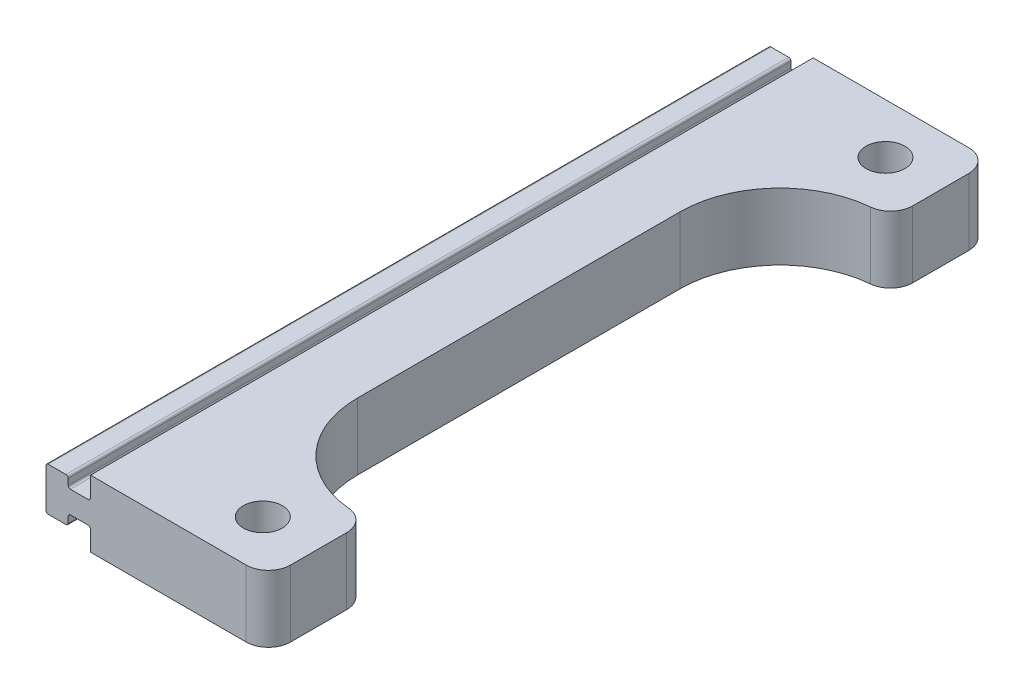
ISO-10303-21;
HEADER;
FILE_DESCRIPTION(('STEP AP214'),'2;1');
FILE_NAME('part.step','',(''),(''),'','','');
FILE_SCHEMA(('AUTOMOTIVE_DESIGN { 1 0 10303 214 1 1 1 1 }'));
ENDSEC;
DATA;
#1=APPLICATION_CONTEXT('core data for automotive mechanical design processes');
#2=APPLICATION_PROTOCOL_DEFINITION('international standard','automotive_design',2000,#1);
#3=PRODUCT_CONTEXT('',#1,'mechanical');
#4=PRODUCT('Part','Part','',(#3));
#5=PRODUCT_RELATED_PRODUCT_CATEGORY('part','',(#4));
#6=PRODUCT_DEFINITION_FORMATION('','',#4);
#7=PRODUCT_DEFINITION_CONTEXT('part definition',#1,'design');
#8=PRODUCT_DEFINITION('design','',#6,#7);
#9=PRODUCT_DEFINITION_SHAPE('','',#8);
#10=(LENGTH_UNIT() NAMED_UNIT(*) SI_UNIT(.MILLI.,.METRE.));
#11=(NAMED_UNIT(*) PLANE_ANGLE_UNIT() SI_UNIT($,.RADIAN.));
#12=(NAMED_UNIT(*) SI_UNIT($,.STERADIAN.) SOLID_ANGLE_UNIT());
#13=UNCERTAINTY_MEASURE_WITH_UNIT(LENGTH_MEASURE(1.E-05),#10,'distance_accuracy_value','');
#14=(GEOMETRIC_REPRESENTATION_CONTEXT(3) GLOBAL_UNCERTAINTY_ASSIGNED_CONTEXT((#13)) GLOBAL_UNIT_ASSIGNED_CONTEXT((#10,
#11,#12)) REPRESENTATION_CONTEXT('',''));
#15=CARTESIAN_POINT('',(0.,0.,0.));
#16=DIRECTION('',(0.,0.,1.));
#17=DIRECTION('',(1.,0.,0.));
#18=AXIS2_PLACEMENT_3D('',#15,#16,#17);
#19=CARTESIAN_POINT('',(15.,6.,32.5));
#20=DIRECTION('',(-1.,0.,0.));
#21=DIRECTION('',(0.,0.,1.));
#22=AXIS2_PLACEMENT_3D('',#19,#20,#21);
#23=PLANE('',#22);
#24=DIRECTION('',(0.,0.,-1.));
#25=VECTOR('',#24,1.);
#26=CARTESIAN_POINT('',(15.,6.,32.5));
#27=LINE('',#26,#25);
#28=CARTESIAN_POINT('',(15.,6.,30.5));
#29=VERTEX_POINT('',#28);
#30=CARTESIAN_POINT('',(15.,6.,25.4544511501033));
#31=VERTEX_POINT('',#30);
#32=EDGE_CURVE('E294',#29,#31,#27,.T.);
#33=ORIENTED_EDGE('',*,*,#32,.F.);
#34=DIRECTION('',(0.,-1.,0.));
#35=VECTOR('',#34,1.);
#36=CARTESIAN_POINT('',(15.,6.,30.5));
#37=LINE('',#36,#35);
#38=CARTESIAN_POINT('',(15.,0.,30.5));
#39=VERTEX_POINT('',#38);
#40=EDGE_CURVE('E403',#29,#39,#37,.T.);
#41=ORIENTED_EDGE('',*,*,#40,.T.);
#42=DIRECTION('',(0.,0.,-1.));
#43=VECTOR('',#42,1.);
#44=CARTESIAN_POINT('',(15.,0.,32.5));
#45=LINE('',#44,#43);
#46=CARTESIAN_POINT('',(15.,0.,25.4544511501033));
#47=VERTEX_POINT('',#46);
#48=EDGE_CURVE('E289',#39,#47,#45,.T.);
#49=ORIENTED_EDGE('',*,*,#48,.T.);
#50=DIRECTION('',(0.,-1.,0.));
#51=VECTOR('',#50,1.);
#52=CARTESIAN_POINT('',(15.,6.,25.4544511501033));
#53=LINE('',#52,#51);
#54=EDGE_CURVE('E401',#47,#31,#53,.F.);
#55=ORIENTED_EDGE('',*,*,#54,.T.);
#56=EDGE_LOOP('',(#33,#41,#49,#55));
#57=FACE_BOUND('',#56,.T.);
#58=ADVANCED_FACE('F35',(#57),#23,.F.);
#59=CARTESIAN_POINT('',(14.,6.,14.5));
#60=DIRECTION('',(0.,-1.,0.));
#61=DIRECTION('',(0.,0.,-1.));
#62=AXIS2_PLACEMENT_3D('',#59,#60,#61);
#63=CYLINDRICAL_SURFACE('',#62,9.);
#64=CARTESIAN_POINT('',(14.,6.,14.5));
#65=DIRECTION('',(0.,-1.,0.));
#66=DIRECTION('',(0.,0.,-1.));
#67=AXIS2_PLACEMENT_3D('',#64,#65,#66);
#68=CIRCLE('',#67,9.);
#69=CARTESIAN_POINT('',(13.1818181818182,6.,23.4627327591754));
#70=VERTEX_POINT('',#69);
#71=CARTESIAN_POINT('',(5.00000000000001,6.,14.4999999999999));
#72=VERTEX_POINT('',#71);
#73=EDGE_CURVE('E298',#70,#72,#68,.T.);
#74=ORIENTED_EDGE('',*,*,#73,.F.);
#75=DIRECTION('',(0.,-1.,0.));
#76=VECTOR('',#75,1.);
#77=CARTESIAN_POINT('',(13.1818181818182,6.,23.4627327591754));
#78=LINE('',#77,#76);
#79=CARTESIAN_POINT('',(13.1818181818182,0.,23.4627327591754));
#80=VERTEX_POINT('',#79);
#81=EDGE_CURVE('E422',#70,#80,#78,.T.);
#82=ORIENTED_EDGE('',*,*,#81,.T.);
#83=CARTESIAN_POINT('',(14.,0.,14.5));
#84=DIRECTION('',(0.,-1.,0.));
#85=DIRECTION('',(0.,0.,-1.));
#86=AXIS2_PLACEMENT_3D('',#83,#84,#85);
#87=CIRCLE('',#86,9.);
#88=CARTESIAN_POINT('',(5.00000000000001,0.,14.4999999999999));
#89=VERTEX_POINT('',#88);
#90=EDGE_CURVE('E307',#80,#89,#87,.T.);
#91=ORIENTED_EDGE('',*,*,#90,.T.);
#92=DIRECTION('',(0.,-1.,0.));
#93=VECTOR('',#92,1.);
#94=CARTESIAN_POINT('',(5.00000000000001,6.,14.4999999999999));
#95=LINE('',#94,#93);
#96=EDGE_CURVE('E328',#72,#89,#95,.T.);
#97=ORIENTED_EDGE('',*,*,#96,.F.);
#98=EDGE_LOOP('',(#74,#82,#91,#97));
#99=FACE_BOUND('',#98,.T.);
#100=ADVANCED_FACE('F471',(#99),#63,.F.);
#101=CARTESIAN_POINT('',(5.00000000000001,6.,-14.5));
#102=DIRECTION('',(-1.,0.,0.));
#103=DIRECTION('',(0.,0.,1.));
#104=AXIS2_PLACEMENT_3D('',#101,#102,#103);
#105=PLANE('',#104);
#106=DIRECTION('',(0.,0.,-1.));
#107=VECTOR('',#106,1.);
#108=CARTESIAN_POINT('',(5.00000000000001,0.,-14.5));
#109=LINE('',#108,#107);
#110=CARTESIAN_POINT('',(5.00000000000001,0.,-14.5));
#111=VERTEX_POINT('',#110);
#112=EDGE_CURVE('E309',#89,#111,#109,.T.);
#113=ORIENTED_EDGE('',*,*,#112,.T.);
#114=DIRECTION('',(0.,-1.,0.));
#115=VECTOR('',#114,1.);
#116=CARTESIAN_POINT('',(5.00000000000001,6.,-14.5));
#117=LINE('',#116,#115);
#118=CARTESIAN_POINT('',(5.00000000000001,6.,-14.5));
#119=VERTEX_POINT('',#118);
#120=EDGE_CURVE('E325',#119,#111,#117,.T.);
#121=ORIENTED_EDGE('',*,*,#120,.F.);
#122=DIRECTION('',(0.,0.,-1.));
#123=VECTOR('',#122,1.);
#124=CARTESIAN_POINT('',(5.00000000000001,6.,-14.5));
#125=LINE('',#124,#123);
#126=EDGE_CURVE('E300',#72,#119,#125,.T.);
#127=ORIENTED_EDGE('',*,*,#126,.F.);
#128=ORIENTED_EDGE('',*,*,#96,.T.);
#129=EDGE_LOOP('',(#113,#121,#127,#128));
#130=FACE_BOUND('',#129,.T.);
#131=ADVANCED_FACE('F475',(#130),#105,.F.);
#132=CARTESIAN_POINT('',(14.,6.,-14.5));
#133=DIRECTION('',(0.,-1.,0.));
#134=DIRECTION('',(0.,0.,-1.));
#135=AXIS2_PLACEMENT_3D('',#132,#133,#134);
#136=CYLINDRICAL_SURFACE('',#135,9.);
#137=CARTESIAN_POINT('',(14.,0.,-14.5));
#138=DIRECTION('',(0.,-1.,0.));
#139=DIRECTION('',(0.,0.,1.));
#140=AXIS2_PLACEMENT_3D('',#137,#138,#139);
#141=CIRCLE('',#140,9.);
#142=CARTESIAN_POINT('',(13.1818181818182,0.,-23.4627327591755));
#143=VERTEX_POINT('',#142);
#144=EDGE_CURVE('E311',#111,#143,#141,.T.);
#145=ORIENTED_EDGE('',*,*,#144,.T.);
#146=DIRECTION('',(0.,-1.,0.));
#147=VECTOR('',#146,1.);
#148=CARTESIAN_POINT('',(13.1818181818182,6.,-23.4627327591755));
#149=LINE('',#148,#147);
#150=CARTESIAN_POINT('',(13.1818181818182,6.,-23.4627327591755));
#151=VERTEX_POINT('',#150);
#152=EDGE_CURVE('E43',#143,#151,#149,.F.);
#153=ORIENTED_EDGE('',*,*,#152,.T.);
#154=CARTESIAN_POINT('',(14.,6.,-14.5));
#155=DIRECTION('',(0.,-1.,0.));
#156=DIRECTION('',(0.,0.,1.));
#157=AXIS2_PLACEMENT_3D('',#154,#155,#156);
#158=CIRCLE('',#157,9.);
#159=EDGE_CURVE('E302',#119,#151,#158,.T.);
#160=ORIENTED_EDGE('',*,*,#159,.F.);
#161=ORIENTED_EDGE('',*,*,#120,.T.);
#162=EDGE_LOOP('',(#145,#153,#160,#161));
#163=FACE_BOUND('',#162,.T.);
#164=ADVANCED_FACE('F431',(#163),#136,.F.);
#165=CARTESIAN_POINT('',(15.,6.,-32.5));
#166=DIRECTION('',(-1.,0.,0.));
#167=DIRECTION('',(0.,0.,1.));
#168=AXIS2_PLACEMENT_3D('',#165,#166,#167);
#169=PLANE('',#168);
#170=DIRECTION('',(0.,0.,-1.));
#171=VECTOR('',#170,1.);
#172=CARTESIAN_POINT('',(15.,6.,-32.5));
#173=LINE('',#172,#171);
#174=CARTESIAN_POINT('',(15.,6.,-25.4544511501034));
#175=VERTEX_POINT('',#174);
#176=CARTESIAN_POINT('',(15.,6.,-30.5));
#177=VERTEX_POINT('',#176);
#178=EDGE_CURVE('E233',#175,#177,#173,.T.);
#179=ORIENTED_EDGE('',*,*,#178,.F.);
#180=DIRECTION('',(0.,-1.,0.));
#181=VECTOR('',#180,1.);
#182=CARTESIAN_POINT('',(15.,6.,-25.4544511501034));
#183=LINE('',#182,#181);
#184=CARTESIAN_POINT('',(15.,0.,-25.4544511501034));
#185=VERTEX_POINT('',#184);
#186=EDGE_CURVE('E426',#175,#185,#183,.T.);
#187=ORIENTED_EDGE('',*,*,#186,.T.);
#188=DIRECTION('',(0.,0.,-1.));
#189=VECTOR('',#188,1.);
#190=CARTESIAN_POINT('',(15.,0.,-32.5));
#191=LINE('',#190,#189);
#192=CARTESIAN_POINT('',(15.,0.,-30.5));
#193=VERTEX_POINT('',#192);
#194=EDGE_CURVE('E314',#185,#193,#191,.T.);
#195=ORIENTED_EDGE('',*,*,#194,.T.);
#196=DIRECTION('',(0.,-1.,0.));
#197=VECTOR('',#196,1.);
#198=CARTESIAN_POINT('',(15.,6.,-30.5));
#199=LINE('',#198,#197);
#200=EDGE_CURVE('E50',#193,#177,#199,.F.);
#201=ORIENTED_EDGE('',*,*,#200,.T.);
#202=EDGE_LOOP('',(#179,#187,#195,#201));
#203=FACE_BOUND('',#202,.T.);
#204=ADVANCED_FACE('F439',(#203),#169,.F.);
#205=CARTESIAN_POINT('',(-5.,6.,-32.5));
#206=DIRECTION('',(0.,0.,1.));
#207=DIRECTION('',(1.,0.,0.));
#208=AXIS2_PLACEMENT_3D('',#205,#206,#207);
#209=PLANE('',#208);
#210=DIRECTION('',(-1.,0.,0.));
#211=VECTOR('',#210,1.);
#212=CARTESIAN_POINT('',(5.,6.,-32.5));
#213=LINE('',#212,#211);
#214=CARTESIAN_POINT('',(13.,6.,-32.5));
#215=VERTEX_POINT('',#214);
#216=CARTESIAN_POINT('',(-0.999999999999994,6.,-32.5));
#217=VERTEX_POINT('',#216);
#218=EDGE_CURVE('E221',#215,#217,#213,.T.);
#219=ORIENTED_EDGE('',*,*,#218,.F.);
#220=DIRECTION('',(0.,-1.,0.));
#221=VECTOR('',#220,1.);
#222=CARTESIAN_POINT('',(13.,6.,-32.5));
#223=LINE('',#222,#221);
#224=CARTESIAN_POINT('',(13.,0.,-32.5));
#225=VERTEX_POINT('',#224);
#226=EDGE_CURVE('E11',#215,#225,#223,.T.);
#227=ORIENTED_EDGE('',*,*,#226,.T.);
#228=DIRECTION('',(-1.,0.,0.));
#229=VECTOR('',#228,1.);
#230=CARTESIAN_POINT('',(-5.,0.,-32.5));
#231=LINE('',#230,#229);
#232=CARTESIAN_POINT('',(-0.999999999999994,0.,-32.5));
#233=VERTEX_POINT('',#232);
#234=EDGE_CURVE('E316',#225,#233,#231,.T.);
#235=ORIENTED_EDGE('',*,*,#234,.T.);
#236=DIRECTION('',(0.,1.,0.));
#237=VECTOR('',#236,1.);
#238=CARTESIAN_POINT('',(-0.999999999999994,0.,-32.5));
#239=LINE('',#238,#237);
#240=CARTESIAN_POINT('',(-0.999999999999994,1.8,-32.5));
#241=VERTEX_POINT('',#240);
#242=EDGE_CURVE('E257',#233,#241,#239,.T.);
#243=ORIENTED_EDGE('',*,*,#242,.T.);
#244=CARTESIAN_POINT('',(-1.19999999999999,1.8,-32.5));
#245=DIRECTION('',(0.,0.,1.));
#246=DIRECTION('',(1.,0.,0.));
#247=AXIS2_PLACEMENT_3D('',#244,#245,#246);
#248=CIRCLE('',#247,0.2);
#249=CARTESIAN_POINT('',(-1.19999999999999,2.,-32.5));
#250=VERTEX_POINT('',#249);
#251=EDGE_CURVE('E388',#241,#250,#248,.T.);
#252=ORIENTED_EDGE('',*,*,#251,.T.);
#253=DIRECTION('',(-1.,0.,0.));
#254=VECTOR('',#253,1.);
#255=CARTESIAN_POINT('',(-0.999999999999994,2.,-32.5));
#256=LINE('',#255,#254);
#257=CARTESIAN_POINT('',(-2.79999999999999,2.,-32.5));
#258=VERTEX_POINT('',#257);
#259=EDGE_CURVE('E260',#250,#258,#256,.T.);
#260=ORIENTED_EDGE('',*,*,#259,.T.);
#261=CARTESIAN_POINT('',(-2.79999999999999,1.8,-32.5));
#262=DIRECTION('',(0.,0.,1.));
#263=DIRECTION('',(1.,0.,0.));
#264=AXIS2_PLACEMENT_3D('',#261,#262,#263);
#265=CIRCLE('',#264,0.2);
#266=CARTESIAN_POINT('',(-2.99999999999999,1.8,-32.5));
#267=VERTEX_POINT('',#266);
#268=EDGE_CURVE('E395',#258,#267,#265,.T.);
#269=ORIENTED_EDGE('',*,*,#268,.T.);
#270=DIRECTION('',(0.,-1.,0.));
#271=VECTOR('',#270,1.);
#272=CARTESIAN_POINT('',(-2.99999999999999,2.,-32.5));
#273=LINE('',#272,#271);
#274=CARTESIAN_POINT('',(-2.99999999999999,1.25,-32.5));
#275=VERTEX_POINT('',#274);
#276=EDGE_CURVE('E264',#267,#275,#273,.T.);
#277=ORIENTED_EDGE('',*,*,#276,.T.);
#278=CARTESIAN_POINT('',(-3.19999999999999,1.25,-32.5));
#279=DIRECTION('',(0.,0.,1.));
#280=DIRECTION('',(1.,0.,0.));
#281=AXIS2_PLACEMENT_3D('',#278,#279,#280);
#282=CIRCLE('',#281,0.2);
#283=CARTESIAN_POINT('',(-3.19999999999999,1.05,-32.5));
#284=VERTEX_POINT('',#283);
#285=EDGE_CURVE('E355',#275,#284,#282,.F.);
#286=ORIENTED_EDGE('',*,*,#285,.T.);
#287=DIRECTION('',(-1.,0.,0.));
#288=VECTOR('',#287,1.);
#289=CARTESIAN_POINT('',(-2.99999999999999,1.05,-32.5));
#290=LINE('',#289,#288);
#291=CARTESIAN_POINT('',(-4.8,1.05,-32.5));
#292=VERTEX_POINT('',#291);
#293=EDGE_CURVE('E267',#284,#292,#290,.T.);
#294=ORIENTED_EDGE('',*,*,#293,.T.);
#295=CARTESIAN_POINT('',(-4.8,1.25,-32.5));
#296=DIRECTION('',(0.,0.,1.));
#297=DIRECTION('',(1.,0.,0.));
#298=AXIS2_PLACEMENT_3D('',#295,#296,#297);
#299=CIRCLE('',#298,0.2);
#300=CARTESIAN_POINT('',(-5.,1.25,-32.5));
#301=VERTEX_POINT('',#300);
#302=EDGE_CURVE('E353',#292,#301,#299,.F.);
#303=ORIENTED_EDGE('',*,*,#302,.T.);
#304=DIRECTION('',(0.,-1.,0.));
#305=VECTOR('',#304,1.);
#306=CARTESIAN_POINT('',(-5.,6.,-32.5));
#307=LINE('',#306,#305);
#308=CARTESIAN_POINT('',(-5.,4.75,-32.5));
#309=VERTEX_POINT('',#308);
#310=EDGE_CURVE('E322',#309,#301,#307,.T.);
#311=ORIENTED_EDGE('',*,*,#310,.F.);
#312=CARTESIAN_POINT('',(-4.8,4.75,-32.5));
#313=DIRECTION('',(0.,0.,1.));
#314=DIRECTION('',(1.,0.,0.));
#315=AXIS2_PLACEMENT_3D('',#312,#313,#314);
#316=CIRCLE('',#315,0.2);
#317=CARTESIAN_POINT('',(-4.8,4.95,-32.5));
#318=VERTEX_POINT('',#317);
#319=EDGE_CURVE('E351',#309,#318,#316,.F.);
#320=ORIENTED_EDGE('',*,*,#319,.T.);
#321=DIRECTION('',(1.,0.,0.));
#322=VECTOR('',#321,1.);
#323=CARTESIAN_POINT('',(-2.99999999999999,4.95,-32.5));
#324=LINE('',#323,#322);
#325=CARTESIAN_POINT('',(-3.19999999999999,4.95,-32.5));
#326=VERTEX_POINT('',#325);
#327=EDGE_CURVE('E801',#318,#326,#324,.T.);
#328=ORIENTED_EDGE('',*,*,#327,.T.);
#329=CARTESIAN_POINT('',(-3.19999999999999,4.75,-32.5));
#330=DIRECTION('',(0.,0.,1.));
#331=DIRECTION('',(1.,0.,0.));
#332=AXIS2_PLACEMENT_3D('',#329,#330,#331);
#333=CIRCLE('',#332,0.2);
#334=CARTESIAN_POINT('',(-2.99999999999999,4.75,-32.5));
#335=VERTEX_POINT('',#334);
#336=EDGE_CURVE('E349',#326,#335,#333,.F.);
#337=ORIENTED_EDGE('',*,*,#336,.T.);
#338=DIRECTION('',(0.,-1.,0.));
#339=VECTOR('',#338,1.);
#340=CARTESIAN_POINT('',(-2.99999999999999,4.,-32.5));
#341=LINE('',#340,#339);
#342=CARTESIAN_POINT('',(-2.99999999999999,4.2,-32.5));
#343=VERTEX_POINT('',#342);
#344=EDGE_CURVE('E805',#335,#343,#341,.T.);
#345=ORIENTED_EDGE('',*,*,#344,.T.);
#346=CARTESIAN_POINT('',(-2.79999999999999,4.2,-32.5));
#347=DIRECTION('',(0.,0.,1.));
#348=DIRECTION('',(1.,0.,0.));
#349=AXIS2_PLACEMENT_3D('',#346,#347,#348);
#350=CIRCLE('',#349,0.2);
#351=CARTESIAN_POINT('',(-2.79999999999999,4.,-32.5));
#352=VERTEX_POINT('',#351);
#353=EDGE_CURVE('E399',#343,#352,#350,.T.);
#354=ORIENTED_EDGE('',*,*,#353,.T.);
#355=DIRECTION('',(1.,0.,0.));
#356=VECTOR('',#355,1.);
#357=CARTESIAN_POINT('',(-0.999999999999994,4.,-32.5));
#358=LINE('',#357,#356);
#359=CARTESIAN_POINT('',(-1.19999999999999,4.,-32.5));
#360=VERTEX_POINT('',#359);
#361=EDGE_CURVE('E244',#352,#360,#358,.T.);
#362=ORIENTED_EDGE('',*,*,#361,.T.);
#363=CARTESIAN_POINT('',(-1.19999999999999,4.2,-32.5));
#364=DIRECTION('',(0.,0.,1.));
#365=DIRECTION('',(1.,0.,0.));
#366=AXIS2_PLACEMENT_3D('',#363,#364,#365);
#367=CIRCLE('',#366,0.2);
#368=CARTESIAN_POINT('',(-0.999999999999994,4.2,-32.5));
#369=VERTEX_POINT('',#368);
#370=EDGE_CURVE('E240',#360,#369,#367,.T.);
#371=ORIENTED_EDGE('',*,*,#370,.T.);
#372=DIRECTION('',(0.,1.,0.));
#373=VECTOR('',#372,1.);
#374=CARTESIAN_POINT('',(-0.999999999999994,6.,-32.5));
#375=LINE('',#374,#373);
#376=EDGE_CURVE('E236',#369,#217,#375,.T.);
#377=ORIENTED_EDGE('',*,*,#376,.T.);
#378=EDGE_LOOP('',(#219,#227,#235,#243,#252,#260,#269,#277,#286,#294,#303,#311,#320,#328,#337,
#345,#354,#362,#371,#377));
#379=FACE_BOUND('',#378,.T.);
#380=ADVANCED_FACE('F237',(#379),#209,.F.);
#381=CARTESIAN_POINT('',(-5.,6.,-32.5));
#382=DIRECTION('',(1.,0.,0.));
#383=DIRECTION('',(0.,0.,-1.));
#384=AXIS2_PLACEMENT_3D('',#381,#382,#383);
#385=PLANE('',#384);
#386=ORIENTED_EDGE('',*,*,#310,.T.);
#387=DIRECTION('',(0.,0.,1.));
#388=VECTOR('',#387,1.);
#389=CARTESIAN_POINT('',(-5.,1.25,-32.5));
#390=LINE('',#389,#388);
#391=CARTESIAN_POINT('',(-4.99999999999999,1.25,32.5));
#392=VERTEX_POINT('',#391);
#393=EDGE_CURVE('E359',#301,#392,#390,.T.);
#394=ORIENTED_EDGE('',*,*,#393,.T.);
#395=DIRECTION('',(0.,-1.,0.));
#396=VECTOR('',#395,1.);
#397=CARTESIAN_POINT('',(-4.99999999999999,6.,32.5));
#398=LINE('',#397,#396);
#399=CARTESIAN_POINT('',(-4.99999999999999,4.75,32.5));
#400=VERTEX_POINT('',#399);
#401=EDGE_CURVE('E232',#400,#392,#398,.T.);
#402=ORIENTED_EDGE('',*,*,#401,.F.);
#403=DIRECTION('',(0.,0.,1.));
#404=VECTOR('',#403,1.);
#405=CARTESIAN_POINT('',(-5.,4.75,-32.5));
#406=LINE('',#405,#404);
#407=EDGE_CURVE('E357',#400,#309,#406,.F.);
#408=ORIENTED_EDGE('',*,*,#407,.T.);
#409=EDGE_LOOP('',(#386,#394,#402,#408));
#410=FACE_BOUND('',#409,.T.);
#411=ADVANCED_FACE('F577',(#410),#385,.F.);
#412=CARTESIAN_POINT('',(-4.99999999999999,6.,32.5));
#413=DIRECTION('',(0.,0.,-1.));
#414=DIRECTION('',(-1.,0.,0.));
#415=AXIS2_PLACEMENT_3D('',#412,#413,#414);
#416=PLANE('',#415);
#417=DIRECTION('',(1.,0.,0.));
#418=VECTOR('',#417,1.);
#419=CARTESIAN_POINT('',(-4.99999999999999,0.,32.5));
#420=LINE('',#419,#418);
#421=CARTESIAN_POINT('',(-0.999999999999994,0.,32.5));
#422=VERTEX_POINT('',#421);
#423=CARTESIAN_POINT('',(13.,0.,32.5));
#424=VERTEX_POINT('',#423);
#425=EDGE_CURVE('E295',#422,#424,#420,.T.);
#426=ORIENTED_EDGE('',*,*,#425,.T.);
#427=DIRECTION('',(0.,-1.,0.));
#428=VECTOR('',#427,1.);
#429=CARTESIAN_POINT('',(13.,6.,32.5));
#430=LINE('',#429,#428);
#431=CARTESIAN_POINT('',(13.,6.,32.5));
#432=VERTEX_POINT('',#431);
#433=EDGE_CURVE('E414',#424,#432,#430,.F.);
#434=ORIENTED_EDGE('',*,*,#433,.T.);
#435=DIRECTION('',(1.,0.,0.));
#436=VECTOR('',#435,1.);
#437=CARTESIAN_POINT('',(5.00000000000001,6.,32.5));
#438=LINE('',#437,#436);
#439=CARTESIAN_POINT('',(-0.999999999999994,6.,32.5));
#440=VERTEX_POINT('',#439);
#441=EDGE_CURVE('E292',#440,#432,#438,.T.);
#442=ORIENTED_EDGE('',*,*,#441,.F.);
#443=DIRECTION('',(0.,1.,0.));
#444=VECTOR('',#443,1.);
#445=CARTESIAN_POINT('',(-0.999999999999994,6.,32.5));
#446=LINE('',#445,#444);
#447=CARTESIAN_POINT('',(-0.999999999999994,4.2,32.5));
#448=VERTEX_POINT('',#447);
#449=EDGE_CURVE('E248',#448,#440,#446,.T.);
#450=ORIENTED_EDGE('',*,*,#449,.F.);
#451=CARTESIAN_POINT('',(-1.19999999999999,4.2,32.5));
#452=DIRECTION('',(0.,0.,-1.));
#453=DIRECTION('',(-1.,0.,0.));
#454=AXIS2_PLACEMENT_3D('',#451,#452,#453);
#455=CIRCLE('',#454,0.2);
#456=CARTESIAN_POINT('',(-1.19999999999999,4.,32.5));
#457=VERTEX_POINT('',#456);
#458=EDGE_CURVE('E390',#448,#457,#455,.T.);
#459=ORIENTED_EDGE('',*,*,#458,.T.);
#460=DIRECTION('',(1.,0.,0.));
#461=VECTOR('',#460,1.);
#462=CARTESIAN_POINT('',(-0.999999999999994,4.,32.5));
#463=LINE('',#462,#461);
#464=CARTESIAN_POINT('',(-2.79999999999999,4.,32.5));
#465=VERTEX_POINT('',#464);
#466=EDGE_CURVE('E809',#465,#457,#463,.T.);
#467=ORIENTED_EDGE('',*,*,#466,.F.);
#468=CARTESIAN_POINT('',(-2.79999999999999,4.2,32.5));
#469=DIRECTION('',(0.,0.,-1.));
#470=DIRECTION('',(-1.,0.,0.));
#471=AXIS2_PLACEMENT_3D('',#468,#469,#470);
#472=CIRCLE('',#471,0.2);
#473=CARTESIAN_POINT('',(-2.99999999999999,4.2,32.5));
#474=VERTEX_POINT('',#473);
#475=EDGE_CURVE('E397',#465,#474,#472,.T.);
#476=ORIENTED_EDGE('',*,*,#475,.T.);
#477=DIRECTION('',(0.,-1.,0.));
#478=VECTOR('',#477,1.);
#479=CARTESIAN_POINT('',(-2.99999999999999,4.,32.5));
#480=LINE('',#479,#478);
#481=CARTESIAN_POINT('',(-2.99999999999999,4.75,32.5));
#482=VERTEX_POINT('',#481);
#483=EDGE_CURVE('E814',#482,#474,#480,.T.);
#484=ORIENTED_EDGE('',*,*,#483,.F.);
#485=CARTESIAN_POINT('',(-3.19999999999999,4.75,32.5));
#486=DIRECTION('',(0.,0.,-1.));
#487=DIRECTION('',(-1.,0.,0.));
#488=AXIS2_PLACEMENT_3D('',#485,#486,#487);
#489=CIRCLE('',#488,0.2);
#490=CARTESIAN_POINT('',(-3.19999999999999,4.95,32.5));
#491=VERTEX_POINT('',#490);
#492=EDGE_CURVE('E336',#482,#491,#489,.F.);
#493=ORIENTED_EDGE('',*,*,#492,.T.);
#494=DIRECTION('',(1.,0.,0.));
#495=VECTOR('',#494,1.);
#496=CARTESIAN_POINT('',(-2.99999999999999,4.95,32.5));
#497=LINE('',#496,#495);
#498=CARTESIAN_POINT('',(-4.79999999999999,4.95,32.5));
#499=VERTEX_POINT('',#498);
#500=EDGE_CURVE('E812',#499,#491,#497,.T.);
#501=ORIENTED_EDGE('',*,*,#500,.F.);
#502=CARTESIAN_POINT('',(-4.79999999999999,4.75,32.5));
#503=DIRECTION('',(0.,0.,-1.));
#504=DIRECTION('',(-1.,0.,0.));
#505=AXIS2_PLACEMENT_3D('',#502,#503,#504);
#506=CIRCLE('',#505,0.2);
#507=EDGE_CURVE('E338',#499,#400,#506,.F.);
#508=ORIENTED_EDGE('',*,*,#507,.T.);
#509=ORIENTED_EDGE('',*,*,#401,.T.);
#510=CARTESIAN_POINT('',(-4.79999999999999,1.25,32.5));
#511=DIRECTION('',(0.,0.,-1.));
#512=DIRECTION('',(-1.,0.,0.));
#513=AXIS2_PLACEMENT_3D('',#510,#511,#512);
#514=CIRCLE('',#513,0.2);
#515=CARTESIAN_POINT('',(-4.79999999999999,1.05,32.5));
#516=VERTEX_POINT('',#515);
#517=EDGE_CURVE('E340',#392,#516,#514,.F.);
#518=ORIENTED_EDGE('',*,*,#517,.T.);
#519=DIRECTION('',(-1.,0.,0.));
#520=VECTOR('',#519,1.);
#521=CARTESIAN_POINT('',(-2.99999999999999,1.05,32.5));
#522=LINE('',#521,#520);
#523=CARTESIAN_POINT('',(-3.19999999999999,1.05,32.5));
#524=VERTEX_POINT('',#523);
#525=EDGE_CURVE('E261',#524,#516,#522,.T.);
#526=ORIENTED_EDGE('',*,*,#525,.F.);
#527=CARTESIAN_POINT('',(-3.19999999999999,1.25,32.5));
#528=DIRECTION('',(0.,0.,-1.));
#529=DIRECTION('',(-1.,0.,0.));
#530=AXIS2_PLACEMENT_3D('',#527,#528,#529);
#531=CIRCLE('',#530,0.2);
#532=CARTESIAN_POINT('',(-2.99999999999999,1.25,32.5));
#533=VERTEX_POINT('',#532);
#534=EDGE_CURVE('E342',#524,#533,#531,.F.);
#535=ORIENTED_EDGE('',*,*,#534,.T.);
#536=DIRECTION('',(0.,-1.,0.));
#537=VECTOR('',#536,1.);
#538=CARTESIAN_POINT('',(-2.99999999999999,2.,32.5));
#539=LINE('',#538,#537);
#540=CARTESIAN_POINT('',(-2.99999999999999,1.8,32.5));
#541=VERTEX_POINT('',#540);
#542=EDGE_CURVE('E273',#541,#533,#539,.T.);
#543=ORIENTED_EDGE('',*,*,#542,.F.);
#544=CARTESIAN_POINT('',(-2.79999999999999,1.8,32.5));
#545=DIRECTION('',(0.,0.,-1.));
#546=DIRECTION('',(-1.,0.,0.));
#547=AXIS2_PLACEMENT_3D('',#544,#545,#546);
#548=CIRCLE('',#547,0.2);
#549=CARTESIAN_POINT('',(-2.79999999999999,2.,32.5));
#550=VERTEX_POINT('',#549);
#551=EDGE_CURVE('E393',#541,#550,#548,.T.);
#552=ORIENTED_EDGE('',*,*,#551,.T.);
#553=DIRECTION('',(-1.,0.,0.));
#554=VECTOR('',#553,1.);
#555=CARTESIAN_POINT('',(-0.999999999999994,2.,32.5));
#556=LINE('',#555,#554);
#557=CARTESIAN_POINT('',(-1.19999999999999,2.,32.5));
#558=VERTEX_POINT('',#557);
#559=EDGE_CURVE('E252',#558,#550,#556,.T.);
#560=ORIENTED_EDGE('',*,*,#559,.F.);
#561=CARTESIAN_POINT('',(-1.19999999999999,1.8,32.5));
#562=DIRECTION('',(0.,0.,-1.));
#563=DIRECTION('',(-1.,0.,0.));
#564=AXIS2_PLACEMENT_3D('',#561,#562,#563);
#565=CIRCLE('',#564,0.2);
#566=CARTESIAN_POINT('',(-0.999999999999994,1.8,32.5));
#567=VERTEX_POINT('',#566);
#568=EDGE_CURVE('E386',#558,#567,#565,.T.);
#569=ORIENTED_EDGE('',*,*,#568,.T.);
#570=DIRECTION('',(0.,1.,0.));
#571=VECTOR('',#570,1.);
#572=CARTESIAN_POINT('',(-0.999999999999994,0.,32.5));
#573=LINE('',#572,#571);
#574=EDGE_CURVE('E249',#422,#567,#573,.T.);
#575=ORIENTED_EDGE('',*,*,#574,.F.);
#576=EDGE_LOOP('',(#426,#434,#442,#450,#459,#467,#476,#484,#493,#501,#508,#509,#518,#526,#535,
#543,#552,#560,#569,#575));
#577=FACE_BOUND('',#576,.T.);
#578=ADVANCED_FACE('F456',(#577),#416,.F.);
#579=CARTESIAN_POINT('',(14.,6.,14.5));
#580=DIRECTION('',(0.,-1.,0.));
#581=DIRECTION('',(0.,0.,-1.));
#582=AXIS2_PLACEMENT_3D('',#579,#580,#581);
#583=PLANE('',#582);
#584=CARTESIAN_POINT('',(10.,6.,-28.));
#585=DIRECTION('',(0.,1.,0.));
#586=DIRECTION('',(0.,0.,-1.));
#587=AXIS2_PLACEMENT_3D('',#584,#585,#586);
#588=CIRCLE('',#587,1.75);
#589=CARTESIAN_POINT('',(10.,6.,-29.75));
#590=VERTEX_POINT('',#589);
#591=EDGE_CURVE('E279',#590,#590,#588,.T.);
#592=ORIENTED_EDGE('',*,*,#591,.F.);
#593=EDGE_LOOP('',(#592));
#594=FACE_BOUND('',#593,.T.);
#595=CARTESIAN_POINT('',(10.,6.,28.));
#596=DIRECTION('',(0.,1.,0.));
#597=DIRECTION('',(0.,0.,1.));
#598=AXIS2_PLACEMENT_3D('',#595,#596,#597);
#599=CIRCLE('',#598,1.75);
#600=CARTESIAN_POINT('',(10.,6.,29.75));
#601=VERTEX_POINT('',#600);
#602=EDGE_CURVE('E283',#601,#601,#599,.T.);
#603=ORIENTED_EDGE('',*,*,#602,.F.);
#604=EDGE_LOOP('',(#603));
#605=FACE_BOUND('',#604,.T.);
#606=ORIENTED_EDGE('',*,*,#441,.T.);
#607=CARTESIAN_POINT('',(13.,6.,30.5));
#608=DIRECTION('',(0.,-1.,0.));
#609=DIRECTION('',(0.,0.,-1.));
#610=AXIS2_PLACEMENT_3D('',#607,#608,#609);
#611=CIRCLE('',#610,2.);
#612=EDGE_CURVE('E420',#432,#29,#611,.F.);
#613=ORIENTED_EDGE('',*,*,#612,.T.);
#614=ORIENTED_EDGE('',*,*,#32,.T.);
#615=CARTESIAN_POINT('',(13.,6.,25.4544511501033));
#616=DIRECTION('',(0.,-1.,0.));
#617=DIRECTION('',(0.,0.,-1.));
#618=AXIS2_PLACEMENT_3D('',#615,#616,#617);
#619=CIRCLE('',#618,2.);
#620=EDGE_CURVE('E418',#31,#70,#619,.F.);
#621=ORIENTED_EDGE('',*,*,#620,.T.);
#622=ORIENTED_EDGE('',*,*,#73,.T.);
#623=ORIENTED_EDGE('',*,*,#126,.T.);
#624=ORIENTED_EDGE('',*,*,#159,.T.);
#625=CARTESIAN_POINT('',(13.,6.,-25.4544511501034));
#626=DIRECTION('',(0.,-1.,0.));
#627=DIRECTION('',(0.,0.,-1.));
#628=AXIS2_PLACEMENT_3D('',#625,#626,#627);
#629=CIRCLE('',#628,2.);
#630=EDGE_CURVE('E57',#151,#175,#629,.F.);
#631=ORIENTED_EDGE('',*,*,#630,.T.);
#632=ORIENTED_EDGE('',*,*,#178,.T.);
#633=CARTESIAN_POINT('',(13.,6.,-30.5));
#634=DIRECTION('',(0.,-1.,0.));
#635=DIRECTION('',(0.,0.,-1.));
#636=AXIS2_PLACEMENT_3D('',#633,#634,#635);
#637=CIRCLE('',#636,2.);
#638=EDGE_CURVE('E229',#177,#215,#637,.F.);
#639=ORIENTED_EDGE('',*,*,#638,.T.);
#640=ORIENTED_EDGE('',*,*,#218,.T.);
#641=DIRECTION('',(0.,0.,1.));
#642=VECTOR('',#641,1.);
#643=CARTESIAN_POINT('',(-0.999999999999994,6.,-32.5));
#644=LINE('',#643,#642);
#645=EDGE_CURVE('E226',#217,#440,#644,.T.);
#646=ORIENTED_EDGE('',*,*,#645,.T.);
#647=EDGE_LOOP('',(#606,#613,#614,#621,#622,#623,#624,#631,#632,#639,#640,#646));
#648=FACE_BOUND('',#647,.T.);
#649=ADVANCED_FACE('F224',(#594,#605,#648),#583,.F.);
#650=CARTESIAN_POINT('',(14.,0.,14.5));
#651=DIRECTION('',(0.,-1.,0.));
#652=DIRECTION('',(0.,0.,-1.));
#653=AXIS2_PLACEMENT_3D('',#650,#651,#652);
#654=PLANE('',#653);
#655=ORIENTED_EDGE('',*,*,#48,.F.);
#656=CARTESIAN_POINT('',(13.,0.,30.5));
#657=DIRECTION('',(0.,-1.,0.));
#658=DIRECTION('',(0.,0.,-1.));
#659=AXIS2_PLACEMENT_3D('',#656,#657,#658);
#660=CIRCLE('',#659,2.);
#661=EDGE_CURVE('E412',#39,#424,#660,.T.);
#662=ORIENTED_EDGE('',*,*,#661,.T.);
#663=ORIENTED_EDGE('',*,*,#425,.F.);
#664=DIRECTION('',(0.,0.,1.));
#665=VECTOR('',#664,1.);
#666=CARTESIAN_POINT('',(-0.999999999999994,0.,-32.5));
#667=LINE('',#666,#665);
#668=EDGE_CURVE('E269',#233,#422,#667,.T.);
#669=ORIENTED_EDGE('',*,*,#668,.F.);
#670=ORIENTED_EDGE('',*,*,#234,.F.);
#671=CARTESIAN_POINT('',(13.,0.,-30.5));
#672=DIRECTION('',(0.,-1.,0.));
#673=DIRECTION('',(0.,0.,-1.));
#674=AXIS2_PLACEMENT_3D('',#671,#672,#673);
#675=CIRCLE('',#674,2.);
#676=EDGE_CURVE('E406',#225,#193,#675,.T.);
#677=ORIENTED_EDGE('',*,*,#676,.T.);
#678=ORIENTED_EDGE('',*,*,#194,.F.);
#679=CARTESIAN_POINT('',(13.,0.,-25.4544511501034));
#680=DIRECTION('',(0.,-1.,0.));
#681=DIRECTION('',(0.,0.,-1.));
#682=AXIS2_PLACEMENT_3D('',#679,#680,#681);
#683=CIRCLE('',#682,2.);
#684=EDGE_CURVE('E408',#185,#143,#683,.T.);
#685=ORIENTED_EDGE('',*,*,#684,.T.);
#686=ORIENTED_EDGE('',*,*,#144,.F.);
#687=ORIENTED_EDGE('',*,*,#112,.F.);
#688=ORIENTED_EDGE('',*,*,#90,.F.);
#689=CARTESIAN_POINT('',(13.,0.,25.4544511501033));
#690=DIRECTION('',(0.,-1.,0.));
#691=DIRECTION('',(0.,0.,-1.));
#692=AXIS2_PLACEMENT_3D('',#689,#690,#691);
#693=CIRCLE('',#692,2.);
#694=EDGE_CURVE('E410',#80,#47,#693,.T.);
#695=ORIENTED_EDGE('',*,*,#694,.T.);
#696=EDGE_LOOP('',(#655,#662,#663,#669,#670,#677,#678,#685,#686,#687,#688,#695));
#697=FACE_BOUND('',#696,.T.);
#698=CARTESIAN_POINT('',(10.,0.,-28.));
#699=DIRECTION('',(0.,1.,0.));
#700=DIRECTION('',(0.,0.,-1.));
#701=AXIS2_PLACEMENT_3D('',#698,#699,#700);
#702=CIRCLE('',#701,1.75);
#703=CARTESIAN_POINT('',(10.,0.,-29.75));
#704=VERTEX_POINT('',#703);
#705=EDGE_CURVE('E280',#704,#704,#702,.T.);
#706=ORIENTED_EDGE('',*,*,#705,.T.);
#707=EDGE_LOOP('',(#706));
#708=FACE_BOUND('',#707,.T.);
#709=CARTESIAN_POINT('',(10.,0.,28.));
#710=DIRECTION('',(0.,1.,0.));
#711=DIRECTION('',(0.,0.,1.));
#712=AXIS2_PLACEMENT_3D('',#709,#710,#711);
#713=CIRCLE('',#712,1.75);
#714=CARTESIAN_POINT('',(10.,0.,29.75));
#715=VERTEX_POINT('',#714);
#716=EDGE_CURVE('E286',#715,#715,#713,.T.);
#717=ORIENTED_EDGE('',*,*,#716,.T.);
#718=EDGE_LOOP('',(#717));
#719=FACE_BOUND('',#718,.T.);
#720=ADVANCED_FACE('F442',(#697,#708,#719),#654,.T.);
#721=CARTESIAN_POINT('',(10.,0.,28.));
#722=DIRECTION('',(0.,1.,0.));
#723=DIRECTION('',(0.,0.,1.));
#724=AXIS2_PLACEMENT_3D('',#721,#722,#723);
#725=CYLINDRICAL_SURFACE('',#724,1.75);
#726=ORIENTED_EDGE('',*,*,#716,.F.);
#727=EDGE_LOOP('',(#726));
#728=FACE_BOUND('',#727,.T.);
#729=ORIENTED_EDGE('',*,*,#602,.T.);
#730=EDGE_LOOP('',(#729));
#731=FACE_BOUND('',#730,.T.);
#732=ADVANCED_FACE('F557',(#728,#731),#725,.F.);
#733=CARTESIAN_POINT('',(10.,0.,-28.));
#734=DIRECTION('',(0.,1.,0.));
#735=DIRECTION('',(0.,0.,1.));
#736=AXIS2_PLACEMENT_3D('',#733,#734,#735);
#737=CYLINDRICAL_SURFACE('',#736,1.75);
#738=ORIENTED_EDGE('',*,*,#705,.F.);
#739=EDGE_LOOP('',(#738));
#740=FACE_BOUND('',#739,.T.);
#741=ORIENTED_EDGE('',*,*,#591,.T.);
#742=EDGE_LOOP('',(#741));
#743=FACE_BOUND('',#742,.T.);
#744=ADVANCED_FACE('F736',(#740,#743),#737,.F.);
#745=CARTESIAN_POINT('',(-2.99999999999999,1.05,-32.5));
#746=DIRECTION('',(0.,1.,0.));
#747=DIRECTION('',(-1.,0.,0.));
#748=AXIS2_PLACEMENT_3D('',#745,#746,#747);
#749=PLANE('',#748);
#750=ORIENTED_EDGE('',*,*,#293,.F.);
#751=DIRECTION('',(0.,0.,1.));
#752=VECTOR('',#751,1.);
#753=CARTESIAN_POINT('',(-3.19999999999999,1.05,-32.5));
#754=LINE('',#753,#752);
#755=EDGE_CURVE('E333',#284,#524,#754,.T.);
#756=ORIENTED_EDGE('',*,*,#755,.T.);
#757=ORIENTED_EDGE('',*,*,#525,.T.);
#758=DIRECTION('',(0.,0.,1.));
#759=VECTOR('',#758,1.);
#760=CARTESIAN_POINT('',(-4.8,1.05,-32.5));
#761=LINE('',#760,#759);
#762=EDGE_CURVE('E331',#516,#292,#761,.F.);
#763=ORIENTED_EDGE('',*,*,#762,.T.);
#764=EDGE_LOOP('',(#750,#756,#757,#763));
#765=FACE_BOUND('',#764,.T.);
#766=ADVANCED_FACE('F726',(#765),#749,.F.);
#767=CARTESIAN_POINT('',(-2.99999999999999,2.,-32.5));
#768=DIRECTION('',(-1.,0.,0.));
#769=DIRECTION('',(0.,0.,1.));
#770=AXIS2_PLACEMENT_3D('',#767,#768,#769);
#771=PLANE('',#770);
#772=ORIENTED_EDGE('',*,*,#542,.T.);
#773=DIRECTION('',(0.,0.,1.));
#774=VECTOR('',#773,1.);
#775=CARTESIAN_POINT('',(-2.99999999999999,1.25,-32.5));
#776=LINE('',#775,#774);
#777=EDGE_CURVE('E347',#533,#275,#776,.F.);
#778=ORIENTED_EDGE('',*,*,#777,.T.);
#779=ORIENTED_EDGE('',*,*,#276,.F.);
#780=DIRECTION('',(0.,0.,1.));
#781=VECTOR('',#780,1.);
#782=CARTESIAN_POINT('',(-2.99999999999999,1.8,32.5));
#783=LINE('',#782,#781);
#784=EDGE_CURVE('E344',#267,#541,#783,.T.);
#785=ORIENTED_EDGE('',*,*,#784,.T.);
#786=EDGE_LOOP('',(#772,#778,#779,#785));
#787=FACE_BOUND('',#786,.T.);
#788=ADVANCED_FACE('F716',(#787),#771,.F.);
#789=CARTESIAN_POINT('',(-0.999999999999994,2.,-32.5));
#790=DIRECTION('',(0.,1.,0.));
#791=DIRECTION('',(-1.,0.,0.));
#792=AXIS2_PLACEMENT_3D('',#789,#790,#791);
#793=PLANE('',#792);
#794=ORIENTED_EDGE('',*,*,#259,.F.);
#795=DIRECTION('',(0.,0.,1.));
#796=VECTOR('',#795,1.);
#797=CARTESIAN_POINT('',(-1.19999999999999,2.,32.5));
#798=LINE('',#797,#796);
#799=EDGE_CURVE('E374',#250,#558,#798,.T.);
#800=ORIENTED_EDGE('',*,*,#799,.T.);
#801=ORIENTED_EDGE('',*,*,#559,.T.);
#802=DIRECTION('',(0.,0.,1.));
#803=VECTOR('',#802,1.);
#804=CARTESIAN_POINT('',(-2.79999999999999,2.,-32.5));
#805=LINE('',#804,#803);
#806=EDGE_CURVE('E372',#550,#258,#805,.F.);
#807=ORIENTED_EDGE('',*,*,#806,.T.);
#808=EDGE_LOOP('',(#794,#800,#801,#807));
#809=FACE_BOUND('',#808,.T.);
#810=ADVANCED_FACE('F707',(#809),#793,.F.);
#811=CARTESIAN_POINT('',(-0.999999999999994,0.,-32.5));
#812=DIRECTION('',(1.,0.,0.));
#813=DIRECTION('',(0.,0.,-1.));
#814=AXIS2_PLACEMENT_3D('',#811,#812,#813);
#815=PLANE('',#814);
#816=ORIENTED_EDGE('',*,*,#574,.T.);
#817=DIRECTION('',(0.,0.,1.));
#818=VECTOR('',#817,1.);
#819=CARTESIAN_POINT('',(-0.999999999999994,1.8,-32.5));
#820=LINE('',#819,#818);
#821=EDGE_CURVE('E377',#567,#241,#820,.F.);
#822=ORIENTED_EDGE('',*,*,#821,.T.);
#823=ORIENTED_EDGE('',*,*,#242,.F.);
#824=ORIENTED_EDGE('',*,*,#668,.T.);
#825=EDGE_LOOP('',(#816,#822,#823,#824));
#826=FACE_BOUND('',#825,.T.);
#827=ADVANCED_FACE('F450',(#826),#815,.F.);
#828=CARTESIAN_POINT('',(-0.999999999999994,6.,-32.5));
#829=DIRECTION('',(1.,0.,0.));
#830=DIRECTION('',(0.,0.,-1.));
#831=AXIS2_PLACEMENT_3D('',#828,#829,#830);
#832=PLANE('',#831);
#833=ORIENTED_EDGE('',*,*,#376,.F.);
#834=DIRECTION('',(0.,0.,1.));
#835=VECTOR('',#834,1.);
#836=CARTESIAN_POINT('',(-0.999999999999994,4.2,32.5));
#837=LINE('',#836,#835);
#838=EDGE_CURVE('E379',#369,#448,#837,.T.);
#839=ORIENTED_EDGE('',*,*,#838,.T.);
#840=ORIENTED_EDGE('',*,*,#449,.T.);
#841=ORIENTED_EDGE('',*,*,#645,.F.);
#842=EDGE_LOOP('',(#833,#839,#840,#841));
#843=FACE_BOUND('',#842,.T.);
#844=ADVANCED_FACE('F246',(#843),#832,.F.);
#845=CARTESIAN_POINT('',(-0.999999999999994,4.,-32.5));
#846=DIRECTION('',(0.,-1.,0.));
#847=DIRECTION('',(0.,0.,-1.));
#848=AXIS2_PLACEMENT_3D('',#845,#846,#847);
#849=PLANE('',#848);
#850=ORIENTED_EDGE('',*,*,#466,.T.);
#851=DIRECTION('',(0.,0.,1.));
#852=VECTOR('',#851,1.);
#853=CARTESIAN_POINT('',(-1.19999999999999,4.,-32.5));
#854=LINE('',#853,#852);
#855=EDGE_CURVE('E384',#457,#360,#854,.F.);
#856=ORIENTED_EDGE('',*,*,#855,.T.);
#857=ORIENTED_EDGE('',*,*,#361,.F.);
#858=DIRECTION('',(0.,0.,1.));
#859=VECTOR('',#858,1.);
#860=CARTESIAN_POINT('',(-2.79999999999999,4.,32.5));
#861=LINE('',#860,#859);
#862=EDGE_CURVE('E381',#352,#465,#861,.T.);
#863=ORIENTED_EDGE('',*,*,#862,.T.);
#864=EDGE_LOOP('',(#850,#856,#857,#863));
#865=FACE_BOUND('',#864,.T.);
#866=ADVANCED_FACE('F680',(#865),#849,.F.);
#867=CARTESIAN_POINT('',(-2.99999999999999,4.,-32.5));
#868=DIRECTION('',(-1.,0.,0.));
#869=DIRECTION('',(0.,0.,1.));
#870=AXIS2_PLACEMENT_3D('',#867,#868,#869);
#871=PLANE('',#870);
#872=ORIENTED_EDGE('',*,*,#344,.F.);
#873=DIRECTION('',(0.,0.,1.));
#874=VECTOR('',#873,1.);
#875=CARTESIAN_POINT('',(-2.99999999999999,4.75,-32.5));
#876=LINE('',#875,#874);
#877=EDGE_CURVE('E369',#335,#482,#876,.T.);
#878=ORIENTED_EDGE('',*,*,#877,.T.);
#879=ORIENTED_EDGE('',*,*,#483,.T.);
#880=DIRECTION('',(0.,0.,1.));
#881=VECTOR('',#880,1.);
#882=CARTESIAN_POINT('',(-2.99999999999999,4.2,-32.5));
#883=LINE('',#882,#881);
#884=EDGE_CURVE('E367',#474,#343,#883,.F.);
#885=ORIENTED_EDGE('',*,*,#884,.T.);
#886=EDGE_LOOP('',(#872,#878,#879,#885));
#887=FACE_BOUND('',#886,.T.);
#888=ADVANCED_FACE('F670',(#887),#871,.F.);
#889=CARTESIAN_POINT('',(-2.99999999999999,4.95,-32.5));
#890=DIRECTION('',(0.,-1.,0.));
#891=DIRECTION('',(0.,0.,-1.));
#892=AXIS2_PLACEMENT_3D('',#889,#890,#891);
#893=PLANE('',#892);
#894=ORIENTED_EDGE('',*,*,#327,.F.);
#895=DIRECTION('',(0.,0.,1.));
#896=VECTOR('',#895,1.);
#897=CARTESIAN_POINT('',(-4.8,4.95,-32.5));
#898=LINE('',#897,#896);
#899=EDGE_CURVE('E364',#318,#499,#898,.T.);
#900=ORIENTED_EDGE('',*,*,#899,.T.);
#901=ORIENTED_EDGE('',*,*,#500,.T.);
#902=DIRECTION('',(0.,0.,1.));
#903=VECTOR('',#902,1.);
#904=CARTESIAN_POINT('',(-3.19999999999999,4.95,-32.5));
#905=LINE('',#904,#903);
#906=EDGE_CURVE('E362',#491,#326,#905,.F.);
#907=ORIENTED_EDGE('',*,*,#906,.T.);
#908=EDGE_LOOP('',(#894,#900,#901,#907));
#909=FACE_BOUND('',#908,.T.);
#910=ADVANCED_FACE('F493',(#909),#893,.F.);
#911=CARTESIAN_POINT('',(-3.19999999999999,1.25,-32.5));
#912=DIRECTION('',(0.,0.,1.));
#913=DIRECTION('',(1.,0.,0.));
#914=AXIS2_PLACEMENT_3D('',#911,#912,#913);
#915=CYLINDRICAL_SURFACE('',#914,0.2);
#916=ORIENTED_EDGE('',*,*,#285,.F.);
#917=ORIENTED_EDGE('',*,*,#777,.F.);
#918=ORIENTED_EDGE('',*,*,#534,.F.);
#919=ORIENTED_EDGE('',*,*,#755,.F.);
#920=EDGE_LOOP('',(#916,#917,#918,#919));
#921=FACE_BOUND('',#920,.T.);
#922=ADVANCED_FACE('F489',(#921),#915,.T.);
#923=CARTESIAN_POINT('',(-4.8,1.25,-32.5));
#924=DIRECTION('',(0.,0.,1.));
#925=DIRECTION('',(1.,0.,0.));
#926=AXIS2_PLACEMENT_3D('',#923,#924,#925);
#927=CYLINDRICAL_SURFACE('',#926,0.2);
#928=ORIENTED_EDGE('',*,*,#302,.F.);
#929=ORIENTED_EDGE('',*,*,#762,.F.);
#930=ORIENTED_EDGE('',*,*,#517,.F.);
#931=ORIENTED_EDGE('',*,*,#393,.F.);
#932=EDGE_LOOP('',(#928,#929,#930,#931));
#933=FACE_BOUND('',#932,.T.);
#934=ADVANCED_FACE('F492',(#933),#927,.T.);
#935=CARTESIAN_POINT('',(-4.8,4.75,-32.5));
#936=DIRECTION('',(0.,0.,1.));
#937=DIRECTION('',(1.,0.,0.));
#938=AXIS2_PLACEMENT_3D('',#935,#936,#937);
#939=CYLINDRICAL_SURFACE('',#938,0.2);
#940=ORIENTED_EDGE('',*,*,#319,.F.);
#941=ORIENTED_EDGE('',*,*,#407,.F.);
#942=ORIENTED_EDGE('',*,*,#507,.F.);
#943=ORIENTED_EDGE('',*,*,#899,.F.);
#944=EDGE_LOOP('',(#940,#941,#942,#943));
#945=FACE_BOUND('',#944,.T.);
#946=ADVANCED_FACE('F497',(#945),#939,.T.);
#947=CARTESIAN_POINT('',(-3.19999999999999,4.75,-32.5));
#948=DIRECTION('',(0.,0.,1.));
#949=DIRECTION('',(1.,0.,0.));
#950=AXIS2_PLACEMENT_3D('',#947,#948,#949);
#951=CYLINDRICAL_SURFACE('',#950,0.2);
#952=ORIENTED_EDGE('',*,*,#336,.F.);
#953=ORIENTED_EDGE('',*,*,#906,.F.);
#954=ORIENTED_EDGE('',*,*,#492,.F.);
#955=ORIENTED_EDGE('',*,*,#877,.F.);
#956=EDGE_LOOP('',(#952,#953,#954,#955));
#957=FACE_BOUND('',#956,.T.);
#958=ADVANCED_FACE('F501',(#957),#951,.T.);
#959=CARTESIAN_POINT('',(-1.19999999999999,1.8,-32.5));
#960=DIRECTION('',(0.,0.,-1.));
#961=DIRECTION('',(-1.,0.,0.));
#962=AXIS2_PLACEMENT_3D('',#959,#960,#961);
#963=CYLINDRICAL_SURFACE('',#962,0.2);
#964=ORIENTED_EDGE('',*,*,#251,.F.);
#965=ORIENTED_EDGE('',*,*,#821,.F.);
#966=ORIENTED_EDGE('',*,*,#568,.F.);
#967=ORIENTED_EDGE('',*,*,#799,.F.);
#968=EDGE_LOOP('',(#964,#965,#966,#967));
#969=FACE_BOUND('',#968,.T.);
#970=ADVANCED_FACE('F505',(#969),#963,.F.);
#971=CARTESIAN_POINT('',(-1.19999999999999,4.2,-32.5));
#972=DIRECTION('',(0.,0.,-1.));
#973=DIRECTION('',(-1.,0.,0.));
#974=AXIS2_PLACEMENT_3D('',#971,#972,#973);
#975=CYLINDRICAL_SURFACE('',#974,0.2);
#976=ORIENTED_EDGE('',*,*,#370,.F.);
#977=ORIENTED_EDGE('',*,*,#855,.F.);
#978=ORIENTED_EDGE('',*,*,#458,.F.);
#979=ORIENTED_EDGE('',*,*,#838,.F.);
#980=EDGE_LOOP('',(#976,#977,#978,#979));
#981=FACE_BOUND('',#980,.T.);
#982=ADVANCED_FACE('F509',(#981),#975,.F.);
#983=CARTESIAN_POINT('',(-2.79999999999999,1.8,-32.5));
#984=DIRECTION('',(0.,0.,-1.));
#985=DIRECTION('',(-1.,0.,0.));
#986=AXIS2_PLACEMENT_3D('',#983,#984,#985);
#987=CYLINDRICAL_SURFACE('',#986,0.2);
#988=ORIENTED_EDGE('',*,*,#268,.F.);
#989=ORIENTED_EDGE('',*,*,#806,.F.);
#990=ORIENTED_EDGE('',*,*,#551,.F.);
#991=ORIENTED_EDGE('',*,*,#784,.F.);
#992=EDGE_LOOP('',(#988,#989,#990,#991));
#993=FACE_BOUND('',#992,.T.);
#994=ADVANCED_FACE('F513',(#993),#987,.F.);
#995=CARTESIAN_POINT('',(-2.79999999999999,4.2,-32.5));
#996=DIRECTION('',(0.,0.,-1.));
#997=DIRECTION('',(-1.,0.,0.));
#998=AXIS2_PLACEMENT_3D('',#995,#996,#997);
#999=CYLINDRICAL_SURFACE('',#998,0.2);
#1000=ORIENTED_EDGE('',*,*,#353,.F.);
#1001=ORIENTED_EDGE('',*,*,#884,.F.);
#1002=ORIENTED_EDGE('',*,*,#475,.F.);
#1003=ORIENTED_EDGE('',*,*,#862,.F.);
#1004=EDGE_LOOP('',(#1000,#1001,#1002,#1003));
#1005=FACE_BOUND('',#1004,.T.);
#1006=ADVANCED_FACE('F517',(#1005),#999,.F.);
#1007=CARTESIAN_POINT('',(13.,6.,30.5));
#1008=DIRECTION('',(0.,-1.,0.));
#1009=DIRECTION('',(0.,0.,-1.));
#1010=AXIS2_PLACEMENT_3D('',#1007,#1008,#1009);
#1011=CYLINDRICAL_SURFACE('',#1010,2.);
#1012=ORIENTED_EDGE('',*,*,#612,.F.);
#1013=ORIENTED_EDGE('',*,*,#433,.F.);
#1014=ORIENTED_EDGE('',*,*,#661,.F.);
#1015=ORIENTED_EDGE('',*,*,#40,.F.);
#1016=EDGE_LOOP('',(#1012,#1013,#1014,#1015));
#1017=FACE_BOUND('',#1016,.T.);
#1018=ADVANCED_FACE('F459',(#1017),#1011,.T.);
#1019=CARTESIAN_POINT('',(13.,6.,25.4544511501033));
#1020=DIRECTION('',(0.,-1.,0.));
#1021=DIRECTION('',(0.,0.,-1.));
#1022=AXIS2_PLACEMENT_3D('',#1019,#1020,#1021);
#1023=CYLINDRICAL_SURFACE('',#1022,2.);
#1024=ORIENTED_EDGE('',*,*,#620,.F.);
#1025=ORIENTED_EDGE('',*,*,#54,.F.);
#1026=ORIENTED_EDGE('',*,*,#694,.F.);
#1027=ORIENTED_EDGE('',*,*,#81,.F.);
#1028=EDGE_LOOP('',(#1024,#1025,#1026,#1027));
#1029=FACE_BOUND('',#1028,.T.);
#1030=ADVANCED_FACE('F466',(#1029),#1023,.T.);
#1031=CARTESIAN_POINT('',(13.,6.,-25.4544511501034));
#1032=DIRECTION('',(0.,-1.,0.));
#1033=DIRECTION('',(0.,0.,-1.));
#1034=AXIS2_PLACEMENT_3D('',#1031,#1032,#1033);
#1035=CYLINDRICAL_SURFACE('',#1034,2.);
#1036=ORIENTED_EDGE('',*,*,#630,.F.);
#1037=ORIENTED_EDGE('',*,*,#152,.F.);
#1038=ORIENTED_EDGE('',*,*,#684,.F.);
#1039=ORIENTED_EDGE('',*,*,#186,.F.);
#1040=EDGE_LOOP('',(#1036,#1037,#1038,#1039));
#1041=FACE_BOUND('',#1040,.T.);
#1042=ADVANCED_FACE('F437',(#1041),#1035,.T.);
#1043=CARTESIAN_POINT('',(13.,6.,-30.5));
#1044=DIRECTION('',(0.,-1.,0.));
#1045=DIRECTION('',(0.,0.,-1.));
#1046=AXIS2_PLACEMENT_3D('',#1043,#1044,#1045);
#1047=CYLINDRICAL_SURFACE('',#1046,2.);
#1048=ORIENTED_EDGE('',*,*,#638,.F.);
#1049=ORIENTED_EDGE('',*,*,#200,.F.);
#1050=ORIENTED_EDGE('',*,*,#676,.F.);
#1051=ORIENTED_EDGE('',*,*,#226,.F.);
#1052=EDGE_LOOP('',(#1048,#1049,#1050,#1051));
#1053=FACE_BOUND('',#1052,.T.);
#1054=ADVANCED_FACE('F37',(#1053),#1047,.T.);
#1055=CLOSED_SHELL('',(#58,#100,#131,#164,#204,#380,#411,#578,#649,#720,#732,#744,#766,#788,
#810,#827,#844,#866,#888,#910,#922,#934,#946,#958,#970,#982,#994,#1006,#1018,#1030,#1042,#1054));
#1056=MANIFOLD_SOLID_BREP('B2',#1055);
#1057=ADVANCED_BREP_SHAPE_REPRESENTATION('',(#18,#1056),#14);
#1058=SHAPE_DEFINITION_REPRESENTATION(#9,#1057);
ENDSEC;
END-ISO-10303-21;
